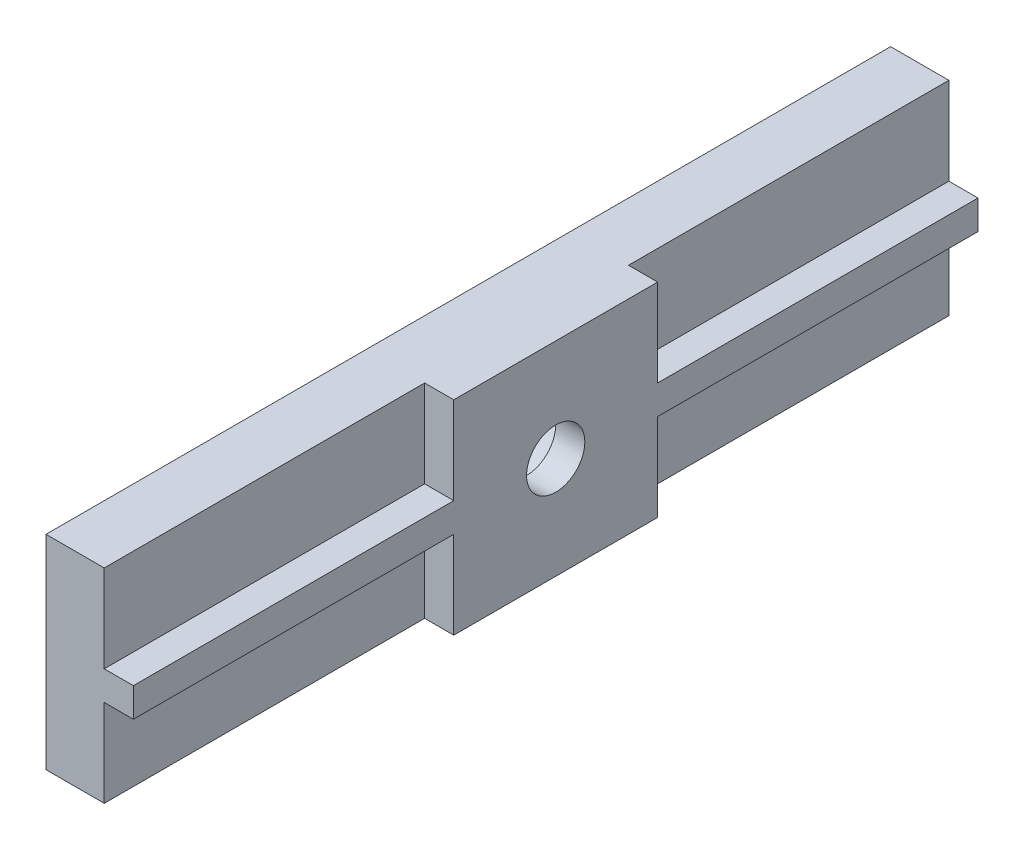
ISO-10303-21;
HEADER;
FILE_DESCRIPTION(('STEP AP214'),'2;1');
FILE_NAME('part.step','',(''),(''),'','','');
FILE_SCHEMA(('AUTOMOTIVE_DESIGN { 1 0 10303 214 1 1 1 1 }'));
ENDSEC;
DATA;
#1=APPLICATION_CONTEXT('core data for automotive mechanical design processes');
#2=APPLICATION_PROTOCOL_DEFINITION('international standard','automotive_design',2000,#1);
#3=PRODUCT_CONTEXT('',#1,'mechanical');
#4=PRODUCT('Part','Part','',(#3));
#5=PRODUCT_RELATED_PRODUCT_CATEGORY('part','',(#4));
#6=PRODUCT_DEFINITION_FORMATION('','',#4);
#7=PRODUCT_DEFINITION_CONTEXT('part definition',#1,'design');
#8=PRODUCT_DEFINITION('design','',#6,#7);
#9=PRODUCT_DEFINITION_SHAPE('','',#8);
#10=(LENGTH_UNIT() NAMED_UNIT(*) SI_UNIT(.MILLI.,.METRE.));
#11=(NAMED_UNIT(*) PLANE_ANGLE_UNIT() SI_UNIT($,.RADIAN.));
#12=(NAMED_UNIT(*) SI_UNIT($,.STERADIAN.) SOLID_ANGLE_UNIT());
#13=UNCERTAINTY_MEASURE_WITH_UNIT(LENGTH_MEASURE(1.E-05),#10,'distance_accuracy_value','');
#14=(GEOMETRIC_REPRESENTATION_CONTEXT(3) GLOBAL_UNCERTAINTY_ASSIGNED_CONTEXT((#13)) GLOBAL_UNIT_ASSIGNED_CONTEXT((#10,
#11,#12)) REPRESENTATION_CONTEXT('',''));
#15=CARTESIAN_POINT('',(0.,0.,0.));
#16=DIRECTION('',(0.,0.,1.));
#17=DIRECTION('',(1.,0.,0.));
#18=AXIS2_PLACEMENT_3D('',#15,#16,#17);
#19=CARTESIAN_POINT('',(6.35,0.,0.));
#20=DIRECTION('',(-1.,0.,0.));
#21=DIRECTION('',(0.,0.,1.));
#22=AXIS2_PLACEMENT_3D('',#19,#20,#21);
#23=CYLINDRICAL_SURFACE('',#22,6.35);
#24=CARTESIAN_POINT('',(6.35,0.,0.));
#25=DIRECTION('',(1.,0.,0.));
#26=DIRECTION('',(0.,0.,-1.));
#27=AXIS2_PLACEMENT_3D('',#24,#25,#26);
#28=CIRCLE('',#27,6.35);
#29=CARTESIAN_POINT('',(6.35,0.,-6.34999999999997));
#30=VERTEX_POINT('',#29);
#31=EDGE_CURVE('E259',#30,#30,#28,.T.);
#32=ORIENTED_EDGE('',*,*,#31,.T.);
#33=EDGE_LOOP('',(#32));
#34=FACE_BOUND('',#33,.T.);
#35=CARTESIAN_POINT('',(0.,0.,0.));
#36=DIRECTION('',(-1.,0.,0.));
#37=DIRECTION('',(0.,0.,1.));
#38=AXIS2_PLACEMENT_3D('',#35,#36,#37);
#39=CIRCLE('',#38,6.35);
#40=CARTESIAN_POINT('',(0.,0.,6.35000000000003));
#41=VERTEX_POINT('',#40);
#42=EDGE_CURVE('E54',#41,#41,#39,.T.);
#43=ORIENTED_EDGE('',*,*,#42,.T.);
#44=EDGE_LOOP('',(#43));
#45=FACE_BOUND('',#44,.T.);
#46=ADVANCED_FACE('F50',(#34,#45),#23,.F.);
#47=CARTESIAN_POINT('',(6.35,0.,-22.225));
#48=DIRECTION('',(0.,0.,1.));
#49=DIRECTION('',(1.,0.,0.));
#50=AXIS2_PLACEMENT_3D('',#47,#48,#49);
#51=PLANE('',#50);
#52=DIRECTION('',(0.,1.,0.));
#53=VECTOR('',#52,1.);
#54=CARTESIAN_POINT('',(0.,0.,-22.225));
#55=LINE('',#54,#53);
#56=CARTESIAN_POINT('',(0.,-22.225,-22.225));
#57=VERTEX_POINT('',#56);
#58=CARTESIAN_POINT('',(0.,-3.17499999999999,-22.225));
#59=VERTEX_POINT('',#58);
#60=EDGE_CURVE('E189',#57,#59,#55,.T.);
#61=ORIENTED_EDGE('',*,*,#60,.T.);
#62=DIRECTION('',(-1.,0.,0.));
#63=VECTOR('',#62,1.);
#64=CARTESIAN_POINT('',(6.35,-3.17499999999999,-22.225));
#65=LINE('',#64,#63);
#66=CARTESIAN_POINT('',(6.35,-3.17499999999999,-22.225));
#67=VERTEX_POINT('',#66);
#68=EDGE_CURVE('E12',#67,#59,#65,.T.);
#69=ORIENTED_EDGE('',*,*,#68,.F.);
#70=DIRECTION('',(0.,1.,0.));
#71=VECTOR('',#70,1.);
#72=CARTESIAN_POINT('',(6.35,0.,-22.225));
#73=LINE('',#72,#71);
#74=CARTESIAN_POINT('',(6.35,-22.225,-22.225));
#75=VERTEX_POINT('',#74);
#76=EDGE_CURVE('E301',#75,#67,#73,.T.);
#77=ORIENTED_EDGE('',*,*,#76,.F.);
#78=DIRECTION('',(-1.,0.,0.));
#79=VECTOR('',#78,1.);
#80=CARTESIAN_POINT('',(6.35,-22.225,-22.225));
#81=LINE('',#80,#79);
#82=EDGE_CURVE('E356',#75,#57,#81,.T.);
#83=ORIENTED_EDGE('',*,*,#82,.T.);
#84=EDGE_LOOP('',(#61,#69,#77,#83));
#85=FACE_BOUND('',#84,.T.);
#86=ADVANCED_FACE('F52',(#85),#51,.F.);
#87=CARTESIAN_POINT('',(6.35,-3.17499999999999,0.));
#88=DIRECTION('',(0.,1.,0.));
#89=DIRECTION('',(0.,0.,1.));
#90=AXIS2_PLACEMENT_3D('',#87,#88,#89);
#91=PLANE('',#90);
#92=DIRECTION('',(0.,0.,-1.));
#93=VECTOR('',#92,1.);
#94=CARTESIAN_POINT('',(0.,-3.17499999999999,0.));
#95=LINE('',#94,#93);
#96=CARTESIAN_POINT('',(0.,-3.17499999999999,-92.075));
#97=VERTEX_POINT('',#96);
#98=EDGE_CURVE('E192',#59,#97,#95,.T.);
#99=ORIENTED_EDGE('',*,*,#98,.T.);
#100=DIRECTION('',(-1.,0.,0.));
#101=VECTOR('',#100,1.);
#102=CARTESIAN_POINT('',(6.35,-3.17499999999999,-92.075));
#103=LINE('',#102,#101);
#104=CARTESIAN_POINT('',(6.35,-3.17499999999999,-92.075));
#105=VERTEX_POINT('',#104);
#106=EDGE_CURVE('E60',#105,#97,#103,.T.);
#107=ORIENTED_EDGE('',*,*,#106,.F.);
#108=DIRECTION('',(0.,0.,-1.));
#109=VECTOR('',#108,1.);
#110=CARTESIAN_POINT('',(6.35,-3.17499999999999,0.));
#111=LINE('',#110,#109);
#112=EDGE_CURVE('E401',#67,#105,#111,.T.);
#113=ORIENTED_EDGE('',*,*,#112,.F.);
#114=ORIENTED_EDGE('',*,*,#68,.T.);
#115=EDGE_LOOP('',(#99,#107,#113,#114));
#116=FACE_BOUND('',#115,.T.);
#117=ADVANCED_FACE('F246',(#116),#91,.F.);
#118=CARTESIAN_POINT('',(6.35,0.,-92.075));
#119=DIRECTION('',(0.,0.,1.));
#120=DIRECTION('',(1.,0.,0.));
#121=AXIS2_PLACEMENT_3D('',#118,#119,#120);
#122=PLANE('',#121);
#123=ORIENTED_EDGE('',*,*,#106,.T.);
#124=DIRECTION('',(0.,1.,0.));
#125=VECTOR('',#124,1.);
#126=CARTESIAN_POINT('',(0.,-22.225,-92.075));
#127=LINE('',#126,#125);
#128=CARTESIAN_POINT('',(0.,-22.225,-92.075));
#129=VERTEX_POINT('',#128);
#130=EDGE_CURVE('E222',#129,#97,#127,.T.);
#131=ORIENTED_EDGE('',*,*,#130,.F.);
#132=DIRECTION('',(1.,0.,0.));
#133=VECTOR('',#132,1.);
#134=CARTESIAN_POINT('',(-12.7,-22.225,-92.075));
#135=LINE('',#134,#133);
#136=CARTESIAN_POINT('',(-12.7,-22.225,-92.075));
#137=VERTEX_POINT('',#136);
#138=EDGE_CURVE('E194',#137,#129,#135,.T.);
#139=ORIENTED_EDGE('',*,*,#138,.F.);
#140=DIRECTION('',(0.,1.,0.));
#141=VECTOR('',#140,1.);
#142=CARTESIAN_POINT('',(-12.7,-22.225,-92.075));
#143=LINE('',#142,#141);
#144=CARTESIAN_POINT('',(-12.7,22.225,-92.075));
#145=VERTEX_POINT('',#144);
#146=EDGE_CURVE('E174',#137,#145,#143,.T.);
#147=ORIENTED_EDGE('',*,*,#146,.T.);
#148=DIRECTION('',(1.,0.,0.));
#149=VECTOR('',#148,1.);
#150=CARTESIAN_POINT('',(-12.7,22.225,-92.075));
#151=LINE('',#150,#149);
#152=CARTESIAN_POINT('',(0.,22.225,-92.075));
#153=VERTEX_POINT('',#152);
#154=EDGE_CURVE('E170',#145,#153,#151,.T.);
#155=ORIENTED_EDGE('',*,*,#154,.T.);
#156=CARTESIAN_POINT('',(0.,3.175,-92.075));
#157=VERTEX_POINT('',#156);
#158=EDGE_CURVE('E219',#157,#153,#127,.T.);
#159=ORIENTED_EDGE('',*,*,#158,.F.);
#160=DIRECTION('',(-1.,0.,0.));
#161=VECTOR('',#160,1.);
#162=CARTESIAN_POINT('',(6.35,3.17500000000001,-92.075));
#163=LINE('',#162,#161);
#164=CARTESIAN_POINT('',(6.35,3.17500000000001,-92.075));
#165=VERTEX_POINT('',#164);
#166=EDGE_CURVE('E274',#165,#157,#163,.T.);
#167=ORIENTED_EDGE('',*,*,#166,.F.);
#168=DIRECTION('',(0.,1.,0.));
#169=VECTOR('',#168,1.);
#170=CARTESIAN_POINT('',(6.35,0.,-92.075));
#171=LINE('',#170,#169);
#172=EDGE_CURVE('E400',#105,#165,#171,.T.);
#173=ORIENTED_EDGE('',*,*,#172,.F.);
#174=EDGE_LOOP('',(#123,#131,#139,#147,#155,#159,#167,#173));
#175=FACE_BOUND('',#174,.T.);
#176=ADVANCED_FACE('F239',(#175),#122,.F.);
#177=CARTESIAN_POINT('',(6.35,3.17500000000001,0.));
#178=DIRECTION('',(0.,1.,0.));
#179=DIRECTION('',(0.,0.,1.));
#180=AXIS2_PLACEMENT_3D('',#177,#178,#179);
#181=PLANE('',#180);
#182=DIRECTION('',(0.,0.,-1.));
#183=VECTOR('',#182,1.);
#184=CARTESIAN_POINT('',(0.,3.17500000000001,0.));
#185=LINE('',#184,#183);
#186=CARTESIAN_POINT('',(0.,3.17500000000001,-22.225));
#187=VERTEX_POINT('',#186);
#188=EDGE_CURVE('E248',#187,#157,#185,.T.);
#189=ORIENTED_EDGE('',*,*,#188,.F.);
#190=DIRECTION('',(-1.,0.,0.));
#191=VECTOR('',#190,1.);
#192=CARTESIAN_POINT('',(6.35,3.17500000000001,-22.225));
#193=LINE('',#192,#191);
#194=CARTESIAN_POINT('',(6.35,3.17500000000001,-22.225));
#195=VERTEX_POINT('',#194);
#196=EDGE_CURVE('E276',#195,#187,#193,.T.);
#197=ORIENTED_EDGE('',*,*,#196,.F.);
#198=DIRECTION('',(0.,0.,-1.));
#199=VECTOR('',#198,1.);
#200=CARTESIAN_POINT('',(6.35,3.17500000000001,0.));
#201=LINE('',#200,#199);
#202=EDGE_CURVE('E343',#195,#165,#201,.T.);
#203=ORIENTED_EDGE('',*,*,#202,.T.);
#204=ORIENTED_EDGE('',*,*,#166,.T.);
#205=EDGE_LOOP('',(#189,#197,#203,#204));
#206=FACE_BOUND('',#205,.T.);
#207=ADVANCED_FACE('F398',(#206),#181,.T.);
#208=CARTESIAN_POINT('',(6.35,0.,-22.225));
#209=DIRECTION('',(0.,0.,1.));
#210=DIRECTION('',(1.,0.,0.));
#211=AXIS2_PLACEMENT_3D('',#208,#209,#210);
#212=PLANE('',#211);
#213=DIRECTION('',(0.,1.,0.));
#214=VECTOR('',#213,1.);
#215=CARTESIAN_POINT('',(0.,0.,-22.225));
#216=LINE('',#215,#214);
#217=CARTESIAN_POINT('',(0.,22.225,-22.225));
#218=VERTEX_POINT('',#217);
#219=EDGE_CURVE('E250',#187,#218,#216,.T.);
#220=ORIENTED_EDGE('',*,*,#219,.T.);
#221=DIRECTION('',(-1.,0.,0.));
#222=VECTOR('',#221,1.);
#223=CARTESIAN_POINT('',(6.35,22.225,-22.225));
#224=LINE('',#223,#222);
#225=CARTESIAN_POINT('',(6.35,22.225,-22.225));
#226=VERTEX_POINT('',#225);
#227=EDGE_CURVE('E283',#226,#218,#224,.T.);
#228=ORIENTED_EDGE('',*,*,#227,.F.);
#229=DIRECTION('',(0.,1.,0.));
#230=VECTOR('',#229,1.);
#231=CARTESIAN_POINT('',(6.35,0.,-22.225));
#232=LINE('',#231,#230);
#233=EDGE_CURVE('E338',#195,#226,#232,.T.);
#234=ORIENTED_EDGE('',*,*,#233,.F.);
#235=ORIENTED_EDGE('',*,*,#196,.T.);
#236=EDGE_LOOP('',(#220,#228,#234,#235));
#237=FACE_BOUND('',#236,.T.);
#238=ADVANCED_FACE('F399',(#237),#212,.F.);
#239=CARTESIAN_POINT('',(6.35,22.225,0.));
#240=DIRECTION('',(0.,1.,0.));
#241=DIRECTION('',(0.,0.,1.));
#242=AXIS2_PLACEMENT_3D('',#239,#240,#241);
#243=PLANE('',#242);
#244=ORIENTED_EDGE('',*,*,#227,.T.);
#245=DIRECTION('',(0.,0.,-1.));
#246=VECTOR('',#245,1.);
#247=CARTESIAN_POINT('',(0.,22.225,92.075));
#248=LINE('',#247,#246);
#249=EDGE_CURVE('E202',#218,#153,#248,.T.);
#250=ORIENTED_EDGE('',*,*,#249,.T.);
#251=ORIENTED_EDGE('',*,*,#154,.F.);
#252=DIRECTION('',(0.,0.,-1.));
#253=VECTOR('',#252,1.);
#254=CARTESIAN_POINT('',(-12.7,22.225,92.075));
#255=LINE('',#254,#253);
#256=CARTESIAN_POINT('',(-12.7,22.225,92.075));
#257=VERTEX_POINT('',#256);
#258=EDGE_CURVE('E162',#257,#145,#255,.T.);
#259=ORIENTED_EDGE('',*,*,#258,.F.);
#260=DIRECTION('',(1.,0.,0.));
#261=VECTOR('',#260,1.);
#262=CARTESIAN_POINT('',(-12.7,22.225,92.075));
#263=LINE('',#262,#261);
#264=CARTESIAN_POINT('',(0.,22.225,92.075));
#265=VERTEX_POINT('',#264);
#266=EDGE_CURVE('E168',#257,#265,#263,.T.);
#267=ORIENTED_EDGE('',*,*,#266,.T.);
#268=CARTESIAN_POINT('',(0.,22.225,22.225));
#269=VERTEX_POINT('',#268);
#270=EDGE_CURVE('E217',#265,#269,#248,.T.);
#271=ORIENTED_EDGE('',*,*,#270,.T.);
#272=DIRECTION('',(-1.,0.,0.));
#273=VECTOR('',#272,1.);
#274=CARTESIAN_POINT('',(6.35,22.225,22.225));
#275=LINE('',#274,#273);
#276=CARTESIAN_POINT('',(6.35,22.225,22.225));
#277=VERTEX_POINT('',#276);
#278=EDGE_CURVE('E286',#277,#269,#275,.T.);
#279=ORIENTED_EDGE('',*,*,#278,.F.);
#280=DIRECTION('',(0.,0.,-1.));
#281=VECTOR('',#280,1.);
#282=CARTESIAN_POINT('',(6.35,22.225,0.));
#283=LINE('',#282,#281);
#284=EDGE_CURVE('E332',#277,#226,#283,.T.);
#285=ORIENTED_EDGE('',*,*,#284,.T.);
#286=EDGE_LOOP('',(#244,#250,#251,#259,#267,#271,#279,#285));
#287=FACE_BOUND('',#286,.T.);
#288=ADVANCED_FACE('F165',(#287),#243,.T.);
#289=CARTESIAN_POINT('',(6.35,0.,22.225));
#290=DIRECTION('',(0.,0.,1.));
#291=DIRECTION('',(1.,0.,0.));
#292=AXIS2_PLACEMENT_3D('',#289,#290,#291);
#293=PLANE('',#292);
#294=DIRECTION('',(0.,1.,0.));
#295=VECTOR('',#294,1.);
#296=CARTESIAN_POINT('',(0.,0.,22.225));
#297=LINE('',#296,#295);
#298=CARTESIAN_POINT('',(0.,3.17500000000001,22.225));
#299=VERTEX_POINT('',#298);
#300=EDGE_CURVE('E268',#299,#269,#297,.T.);
#301=ORIENTED_EDGE('',*,*,#300,.F.);
#302=DIRECTION('',(-1.,0.,0.));
#303=VECTOR('',#302,1.);
#304=CARTESIAN_POINT('',(6.35,3.17500000000001,22.225));
#305=LINE('',#304,#303);
#306=CARTESIAN_POINT('',(6.35,3.17500000000001,22.225));
#307=VERTEX_POINT('',#306);
#308=EDGE_CURVE('E288',#307,#299,#305,.T.);
#309=ORIENTED_EDGE('',*,*,#308,.F.);
#310=DIRECTION('',(0.,1.,0.));
#311=VECTOR('',#310,1.);
#312=CARTESIAN_POINT('',(6.35,0.,22.225));
#313=LINE('',#312,#311);
#314=EDGE_CURVE('E329',#307,#277,#313,.T.);
#315=ORIENTED_EDGE('',*,*,#314,.T.);
#316=ORIENTED_EDGE('',*,*,#278,.T.);
#317=EDGE_LOOP('',(#301,#309,#315,#316));
#318=FACE_BOUND('',#317,.T.);
#319=ADVANCED_FACE('F327',(#318),#293,.T.);
#320=CARTESIAN_POINT('',(6.35,3.17500000000001,0.));
#321=DIRECTION('',(0.,1.,0.));
#322=DIRECTION('',(0.,0.,1.));
#323=AXIS2_PLACEMENT_3D('',#320,#321,#322);
#324=PLANE('',#323);
#325=DIRECTION('',(0.,0.,-1.));
#326=VECTOR('',#325,1.);
#327=CARTESIAN_POINT('',(0.,3.17500000000001,0.));
#328=LINE('',#327,#326);
#329=CARTESIAN_POINT('',(0.,3.175,92.075));
#330=VERTEX_POINT('',#329);
#331=EDGE_CURVE('E307',#330,#299,#328,.T.);
#332=ORIENTED_EDGE('',*,*,#331,.F.);
#333=DIRECTION('',(-1.,0.,0.));
#334=VECTOR('',#333,1.);
#335=CARTESIAN_POINT('',(6.35,3.17500000000001,92.075));
#336=LINE('',#335,#334);
#337=CARTESIAN_POINT('',(6.35,3.17500000000001,92.075));
#338=VERTEX_POINT('',#337);
#339=EDGE_CURVE('E291',#338,#330,#336,.T.);
#340=ORIENTED_EDGE('',*,*,#339,.F.);
#341=DIRECTION('',(0.,0.,-1.));
#342=VECTOR('',#341,1.);
#343=CARTESIAN_POINT('',(6.35,3.17500000000001,0.));
#344=LINE('',#343,#342);
#345=EDGE_CURVE('E341',#338,#307,#344,.T.);
#346=ORIENTED_EDGE('',*,*,#345,.T.);
#347=ORIENTED_EDGE('',*,*,#308,.T.);
#348=EDGE_LOOP('',(#332,#340,#346,#347));
#349=FACE_BOUND('',#348,.T.);
#350=ADVANCED_FACE('F381',(#349),#324,.T.);
#351=CARTESIAN_POINT('',(6.35,0.,92.075));
#352=DIRECTION('',(0.,0.,1.));
#353=DIRECTION('',(1.,0.,0.));
#354=AXIS2_PLACEMENT_3D('',#351,#352,#353);
#355=PLANE('',#354);
#356=ORIENTED_EDGE('',*,*,#339,.T.);
#357=DIRECTION('',(0.,1.,0.));
#358=VECTOR('',#357,1.);
#359=CARTESIAN_POINT('',(0.,-22.225,92.075));
#360=LINE('',#359,#358);
#361=EDGE_CURVE('E187',#330,#265,#360,.T.);
#362=ORIENTED_EDGE('',*,*,#361,.T.);
#363=ORIENTED_EDGE('',*,*,#266,.F.);
#364=DIRECTION('',(0.,1.,0.));
#365=VECTOR('',#364,1.);
#366=CARTESIAN_POINT('',(-12.7,-22.225,92.075));
#367=LINE('',#366,#365);
#368=CARTESIAN_POINT('',(-12.7,-22.225,92.075));
#369=VERTEX_POINT('',#368);
#370=EDGE_CURVE('E175',#369,#257,#367,.T.);
#371=ORIENTED_EDGE('',*,*,#370,.F.);
#372=DIRECTION('',(1.,0.,0.));
#373=VECTOR('',#372,1.);
#374=CARTESIAN_POINT('',(-12.7,-22.225,92.075));
#375=LINE('',#374,#373);
#376=CARTESIAN_POINT('',(0.,-22.225,92.075));
#377=VERTEX_POINT('',#376);
#378=EDGE_CURVE('E228',#369,#377,#375,.T.);
#379=ORIENTED_EDGE('',*,*,#378,.T.);
#380=CARTESIAN_POINT('',(0.,-3.17499999999999,92.075));
#381=VERTEX_POINT('',#380);
#382=EDGE_CURVE('E198',#377,#381,#360,.T.);
#383=ORIENTED_EDGE('',*,*,#382,.T.);
#384=DIRECTION('',(-1.,0.,0.));
#385=VECTOR('',#384,1.);
#386=CARTESIAN_POINT('',(6.35,-3.17499999999999,92.075));
#387=LINE('',#386,#385);
#388=CARTESIAN_POINT('',(6.35,-3.17499999999999,92.075));
#389=VERTEX_POINT('',#388);
#390=EDGE_CURVE('E294',#389,#381,#387,.T.);
#391=ORIENTED_EDGE('',*,*,#390,.F.);
#392=DIRECTION('',(0.,1.,0.));
#393=VECTOR('',#392,1.);
#394=CARTESIAN_POINT('',(6.35,0.,92.075));
#395=LINE('',#394,#393);
#396=EDGE_CURVE('E348',#389,#338,#395,.T.);
#397=ORIENTED_EDGE('',*,*,#396,.T.);
#398=EDGE_LOOP('',(#356,#362,#363,#371,#379,#383,#391,#397));
#399=FACE_BOUND('',#398,.T.);
#400=ADVANCED_FACE('F186',(#399),#355,.T.);
#401=CARTESIAN_POINT('',(6.35,-3.17499999999999,0.));
#402=DIRECTION('',(0.,1.,0.));
#403=DIRECTION('',(0.,0.,1.));
#404=AXIS2_PLACEMENT_3D('',#401,#402,#403);
#405=PLANE('',#404);
#406=DIRECTION('',(0.,0.,-1.));
#407=VECTOR('',#406,1.);
#408=CARTESIAN_POINT('',(0.,-3.17499999999999,0.));
#409=LINE('',#408,#407);
#410=CARTESIAN_POINT('',(0.,-3.17499999999999,22.225));
#411=VERTEX_POINT('',#410);
#412=EDGE_CURVE('E302',#381,#411,#409,.T.);
#413=ORIENTED_EDGE('',*,*,#412,.T.);
#414=DIRECTION('',(-1.,0.,0.));
#415=VECTOR('',#414,1.);
#416=CARTESIAN_POINT('',(6.35,-3.17499999999999,22.225));
#417=LINE('',#416,#415);
#418=CARTESIAN_POINT('',(6.35,-3.17499999999999,22.225));
#419=VERTEX_POINT('',#418);
#420=EDGE_CURVE('E292',#419,#411,#417,.T.);
#421=ORIENTED_EDGE('',*,*,#420,.F.);
#422=DIRECTION('',(0.,0.,-1.));
#423=VECTOR('',#422,1.);
#424=CARTESIAN_POINT('',(6.35,-3.17499999999999,0.));
#425=LINE('',#424,#423);
#426=EDGE_CURVE('E351',#389,#419,#425,.T.);
#427=ORIENTED_EDGE('',*,*,#426,.F.);
#428=ORIENTED_EDGE('',*,*,#390,.T.);
#429=EDGE_LOOP('',(#413,#421,#427,#428));
#430=FACE_BOUND('',#429,.T.);
#431=ADVANCED_FACE('F377',(#430),#405,.F.);
#432=CARTESIAN_POINT('',(6.35,0.,22.225));
#433=DIRECTION('',(0.,0.,1.));
#434=DIRECTION('',(1.,0.,0.));
#435=AXIS2_PLACEMENT_3D('',#432,#433,#434);
#436=PLANE('',#435);
#437=DIRECTION('',(0.,1.,0.));
#438=VECTOR('',#437,1.);
#439=CARTESIAN_POINT('',(0.,0.,22.225));
#440=LINE('',#439,#438);
#441=CARTESIAN_POINT('',(0.,-22.225,22.225));
#442=VERTEX_POINT('',#441);
#443=EDGE_CURVE('E298',#442,#411,#440,.T.);
#444=ORIENTED_EDGE('',*,*,#443,.F.);
#445=DIRECTION('',(-1.,0.,0.));
#446=VECTOR('',#445,1.);
#447=CARTESIAN_POINT('',(6.35,-22.225,22.225));
#448=LINE('',#447,#446);
#449=CARTESIAN_POINT('',(6.35,-22.225,22.225));
#450=VERTEX_POINT('',#449);
#451=EDGE_CURVE('E295',#450,#442,#448,.T.);
#452=ORIENTED_EDGE('',*,*,#451,.F.);
#453=DIRECTION('',(0.,1.,0.));
#454=VECTOR('',#453,1.);
#455=CARTESIAN_POINT('',(6.35,0.,22.225));
#456=LINE('',#455,#454);
#457=EDGE_CURVE('E353',#450,#419,#456,.T.);
#458=ORIENTED_EDGE('',*,*,#457,.T.);
#459=ORIENTED_EDGE('',*,*,#420,.T.);
#460=EDGE_LOOP('',(#444,#452,#458,#459));
#461=FACE_BOUND('',#460,.T.);
#462=ADVANCED_FACE('F370',(#461),#436,.T.);
#463=CARTESIAN_POINT('',(6.35,-22.225,0.));
#464=DIRECTION('',(0.,1.,0.));
#465=DIRECTION('',(0.,0.,1.));
#466=AXIS2_PLACEMENT_3D('',#463,#464,#465);
#467=PLANE('',#466);
#468=ORIENTED_EDGE('',*,*,#451,.T.);
#469=DIRECTION('',(0.,0.,-1.));
#470=VECTOR('',#469,1.);
#471=CARTESIAN_POINT('',(0.,-22.225,92.075));
#472=LINE('',#471,#470);
#473=EDGE_CURVE('E183',#377,#442,#472,.T.);
#474=ORIENTED_EDGE('',*,*,#473,.F.);
#475=ORIENTED_EDGE('',*,*,#378,.F.);
#476=DIRECTION('',(0.,0.,-1.));
#477=VECTOR('',#476,1.);
#478=CARTESIAN_POINT('',(-12.7,-22.225,92.075));
#479=LINE('',#478,#477);
#480=EDGE_CURVE('E181',#369,#137,#479,.T.);
#481=ORIENTED_EDGE('',*,*,#480,.T.);
#482=ORIENTED_EDGE('',*,*,#138,.T.);
#483=EDGE_CURVE('E225',#57,#129,#472,.T.);
#484=ORIENTED_EDGE('',*,*,#483,.F.);
#485=ORIENTED_EDGE('',*,*,#82,.F.);
#486=DIRECTION('',(0.,0.,-1.));
#487=VECTOR('',#486,1.);
#488=CARTESIAN_POINT('',(6.35,-22.225,0.));
#489=LINE('',#488,#487);
#490=EDGE_CURVE('E68',#450,#75,#489,.T.);
#491=ORIENTED_EDGE('',*,*,#490,.F.);
#492=EDGE_LOOP('',(#468,#474,#475,#481,#482,#484,#485,#491));
#493=FACE_BOUND('',#492,.T.);
#494=ADVANCED_FACE('F235',(#493),#467,.F.);
#495=CARTESIAN_POINT('',(6.35,0.,0.));
#496=DIRECTION('',(1.,0.,0.));
#497=DIRECTION('',(0.,0.,-1.));
#498=AXIS2_PLACEMENT_3D('',#495,#496,#497);
#499=PLANE('',#498);
#500=ORIENTED_EDGE('',*,*,#76,.T.);
#501=ORIENTED_EDGE('',*,*,#112,.T.);
#502=ORIENTED_EDGE('',*,*,#172,.T.);
#503=ORIENTED_EDGE('',*,*,#202,.F.);
#504=ORIENTED_EDGE('',*,*,#233,.T.);
#505=ORIENTED_EDGE('',*,*,#284,.F.);
#506=ORIENTED_EDGE('',*,*,#314,.F.);
#507=ORIENTED_EDGE('',*,*,#345,.F.);
#508=ORIENTED_EDGE('',*,*,#396,.F.);
#509=ORIENTED_EDGE('',*,*,#426,.T.);
#510=ORIENTED_EDGE('',*,*,#457,.F.);
#511=ORIENTED_EDGE('',*,*,#490,.T.);
#512=EDGE_LOOP('',(#500,#501,#502,#503,#504,#505,#506,#507,#508,#509,#510,#511));
#513=FACE_BOUND('',#512,.T.);
#514=ORIENTED_EDGE('',*,*,#31,.F.);
#515=EDGE_LOOP('',(#514));
#516=FACE_BOUND('',#515,.T.);
#517=ADVANCED_FACE('F333',(#513,#516),#499,.T.);
#518=CARTESIAN_POINT('',(0.,0.,0.));
#519=DIRECTION('',(-1.,0.,0.));
#520=DIRECTION('',(0.,0.,1.));
#521=AXIS2_PLACEMENT_3D('',#518,#519,#520);
#522=PLANE('',#521);
#523=ORIENTED_EDGE('',*,*,#473,.T.);
#524=ORIENTED_EDGE('',*,*,#443,.T.);
#525=ORIENTED_EDGE('',*,*,#412,.F.);
#526=ORIENTED_EDGE('',*,*,#382,.F.);
#527=EDGE_LOOP('',(#523,#524,#525,#526));
#528=FACE_BOUND('',#527,.T.);
#529=ADVANCED_FACE('F373',(#528),#522,.F.);
#530=ORIENTED_EDGE('',*,*,#361,.F.);
#531=ORIENTED_EDGE('',*,*,#331,.T.);
#532=ORIENTED_EDGE('',*,*,#300,.T.);
#533=ORIENTED_EDGE('',*,*,#270,.F.);
#534=EDGE_LOOP('',(#530,#531,#532,#533));
#535=FACE_BOUND('',#534,.T.);
#536=ADVANCED_FACE('F383',(#535),#522,.F.);
#537=ORIENTED_EDGE('',*,*,#219,.F.);
#538=ORIENTED_EDGE('',*,*,#188,.T.);
#539=ORIENTED_EDGE('',*,*,#158,.T.);
#540=ORIENTED_EDGE('',*,*,#249,.F.);
#541=EDGE_LOOP('',(#537,#538,#539,#540));
#542=FACE_BOUND('',#541,.T.);
#543=ADVANCED_FACE('F397',(#542),#522,.F.);
#544=CARTESIAN_POINT('',(-12.7,0.,0.));
#545=DIRECTION('',(-1.,0.,0.));
#546=DIRECTION('',(0.,0.,1.));
#547=AXIS2_PLACEMENT_3D('',#544,#545,#546);
#548=PLANE('',#547);
#549=CARTESIAN_POINT('',(-12.7,0.,0.));
#550=DIRECTION('',(-1.,0.,0.));
#551=DIRECTION('',(0.,0.,1.));
#552=AXIS2_PLACEMENT_3D('',#549,#550,#551);
#553=CIRCLE('',#552,17.4625);
#554=CARTESIAN_POINT('',(-12.7,0.,17.4625));
#555=VERTEX_POINT('',#554);
#556=EDGE_CURVE('E389',#555,#555,#553,.T.);
#557=ORIENTED_EDGE('',*,*,#556,.F.);
#558=EDGE_LOOP('',(#557));
#559=FACE_BOUND('',#558,.T.);
#560=ORIENTED_EDGE('',*,*,#370,.T.);
#561=ORIENTED_EDGE('',*,*,#258,.T.);
#562=ORIENTED_EDGE('',*,*,#146,.F.);
#563=ORIENTED_EDGE('',*,*,#480,.F.);
#564=EDGE_LOOP('',(#560,#561,#562,#563));
#565=FACE_BOUND('',#564,.T.);
#566=ADVANCED_FACE('F179',(#559,#565),#548,.T.);
#567=ORIENTED_EDGE('',*,*,#60,.F.);
#568=ORIENTED_EDGE('',*,*,#483,.T.);
#569=ORIENTED_EDGE('',*,*,#130,.T.);
#570=ORIENTED_EDGE('',*,*,#98,.F.);
#571=EDGE_LOOP('',(#567,#568,#569,#570));
#572=FACE_BOUND('',#571,.T.);
#573=ADVANCED_FACE('F244',(#572),#522,.F.);
#574=CARTESIAN_POINT('',(0.,0.,0.));
#575=DIRECTION('',(-1.,0.,0.));
#576=DIRECTION('',(0.,0.,1.));
#577=AXIS2_PLACEMENT_3D('',#574,#575,#576);
#578=CYLINDRICAL_SURFACE('',#577,17.4625);
#579=CARTESIAN_POINT('',(0.,0.,0.));
#580=DIRECTION('',(-1.,0.,0.));
#581=DIRECTION('',(0.,0.,1.));
#582=AXIS2_PLACEMENT_3D('',#579,#580,#581);
#583=CIRCLE('',#582,17.4625);
#584=CARTESIAN_POINT('',(0.,0.,17.4625));
#585=VERTEX_POINT('',#584);
#586=EDGE_CURVE('E385',#585,#585,#583,.T.);
#587=ORIENTED_EDGE('',*,*,#586,.F.);
#588=EDGE_LOOP('',(#587));
#589=FACE_BOUND('',#588,.T.);
#590=ORIENTED_EDGE('',*,*,#556,.T.);
#591=EDGE_LOOP('',(#590));
#592=FACE_BOUND('',#591,.T.);
#593=ADVANCED_FACE('F512',(#589,#592),#578,.F.);
#594=CARTESIAN_POINT('',(0.,0.,0.));
#595=DIRECTION('',(-1.,0.,0.));
#596=DIRECTION('',(0.,0.,1.));
#597=AXIS2_PLACEMENT_3D('',#594,#595,#596);
#598=PLANE('',#597);
#599=ORIENTED_EDGE('',*,*,#42,.F.);
#600=EDGE_LOOP('',(#599));
#601=FACE_BOUND('',#600,.T.);
#602=ORIENTED_EDGE('',*,*,#586,.T.);
#603=EDGE_LOOP('',(#602));
#604=FACE_BOUND('',#603,.T.);
#605=ADVANCED_FACE('F522',(#601,#604),#598,.T.);
#606=CLOSED_SHELL('',(#46,#86,#117,#176,#207,#238,#288,#319,#350,#400,#431,#462,#494,#517,#529,
#536,#543,#566,#573,#593,#605));
#607=MANIFOLD_SOLID_BREP('B2',#606);
#608=ADVANCED_BREP_SHAPE_REPRESENTATION('',(#18,#607),#14);
#609=SHAPE_DEFINITION_REPRESENTATION(#9,#608);
ENDSEC;
END-ISO-10303-21;
